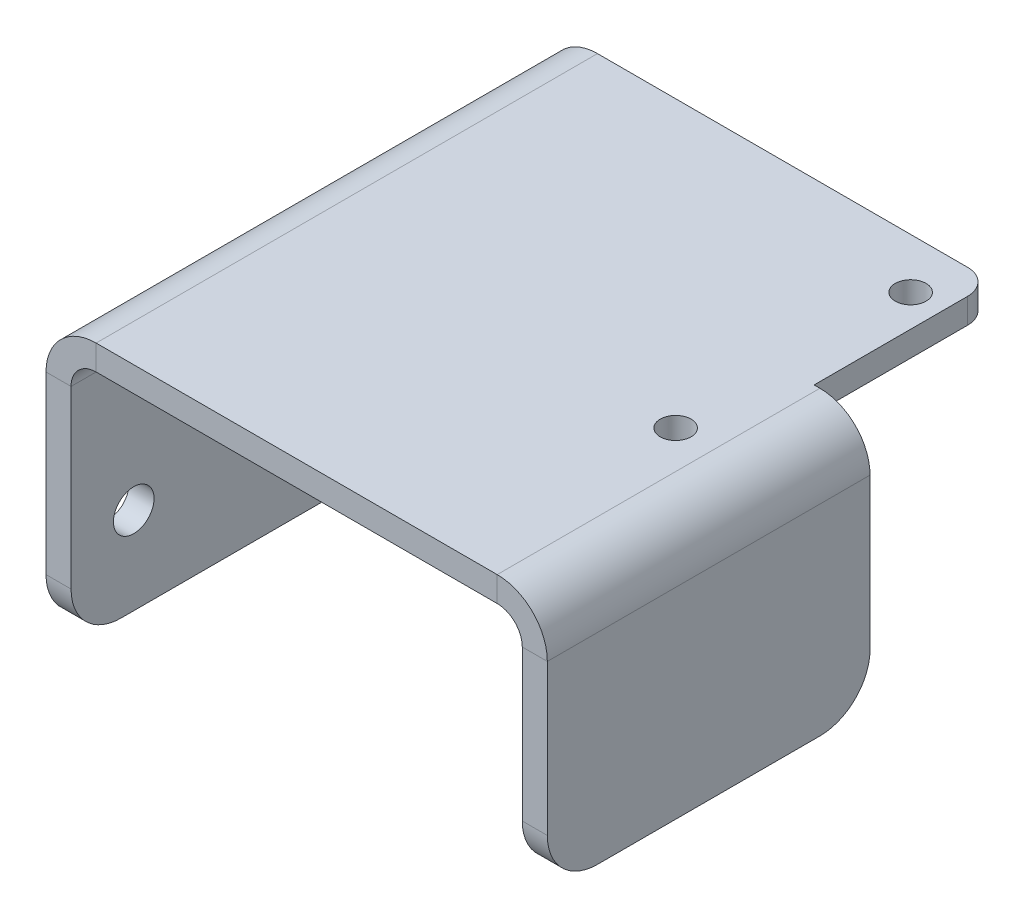
ISO-10303-21;
HEADER;
FILE_DESCRIPTION(('STEP AP214'),'2;1');
FILE_NAME('part.step','',(''),(''),'','','');
FILE_SCHEMA(('AUTOMOTIVE_DESIGN { 1 0 10303 214 1 1 1 1 }'));
ENDSEC;
DATA;
#1=APPLICATION_CONTEXT('core data for automotive mechanical design processes');
#2=APPLICATION_PROTOCOL_DEFINITION('international standard','automotive_design',2000,#1);
#3=PRODUCT_CONTEXT('',#1,'mechanical');
#4=PRODUCT('Part','Part','',(#3));
#5=PRODUCT_RELATED_PRODUCT_CATEGORY('part','',(#4));
#6=PRODUCT_DEFINITION_FORMATION('','',#4);
#7=PRODUCT_DEFINITION_CONTEXT('part definition',#1,'design');
#8=PRODUCT_DEFINITION('design','',#6,#7);
#9=PRODUCT_DEFINITION_SHAPE('','',#8);
#10=(LENGTH_UNIT() NAMED_UNIT(*) SI_UNIT(.MILLI.,.METRE.));
#11=(NAMED_UNIT(*) PLANE_ANGLE_UNIT() SI_UNIT($,.RADIAN.));
#12=(NAMED_UNIT(*) SI_UNIT($,.STERADIAN.) SOLID_ANGLE_UNIT());
#13=UNCERTAINTY_MEASURE_WITH_UNIT(LENGTH_MEASURE(1.E-05),#10,'distance_accuracy_value','');
#14=(GEOMETRIC_REPRESENTATION_CONTEXT(3) GLOBAL_UNCERTAINTY_ASSIGNED_CONTEXT((#13)) GLOBAL_UNIT_ASSIGNED_CONTEXT((#10,
#11,#12)) REPRESENTATION_CONTEXT('',''));
#15=CARTESIAN_POINT('',(0.,0.,0.));
#16=DIRECTION('',(0.,0.,1.));
#17=DIRECTION('',(1.,0.,0.));
#18=AXIS2_PLACEMENT_3D('',#15,#16,#17);
#19=CARTESIAN_POINT('',(52.85,2.00000000000003,-1.75));
#20=DIRECTION('',(0.,-1.,0.));
#21=DIRECTION('',(0.,0.,-1.));
#22=AXIS2_PLACEMENT_3D('',#19,#20,#21);
#23=PLANE('',#22);
#24=CARTESIAN_POINT('',(33.1,2.00000000000006,2.75));
#25=DIRECTION('',(0.,-1.,0.));
#26=DIRECTION('',(0.,0.,-1.));
#27=AXIS2_PLACEMENT_3D('',#24,#25,#26);
#28=CIRCLE('',#27,1.22949999999999);
#29=CARTESIAN_POINT('',(33.1,2.00000000000006,1.52050000000002));
#30=VERTEX_POINT('',#29);
#31=EDGE_CURVE('E282',#30,#30,#28,.T.);
#32=ORIENTED_EDGE('',*,*,#31,.T.);
#33=EDGE_LOOP('',(#32));
#34=FACE_BOUND('',#33,.T.);
#35=CARTESIAN_POINT('',(33.1,2.00000000000006,-16.));
#36=DIRECTION('',(0.,-1.,0.));
#37=DIRECTION('',(0.,0.,-1.));
#38=AXIS2_PLACEMENT_3D('',#35,#36,#37);
#39=CIRCLE('',#38,1.22949999999999);
#40=CARTESIAN_POINT('',(33.1,2.00000000000006,-17.2295));
#41=VERTEX_POINT('',#40);
#42=EDGE_CURVE('E285',#41,#41,#39,.T.);
#43=ORIENTED_EDGE('',*,*,#42,.T.);
#44=EDGE_LOOP('',(#43));
#45=FACE_BOUND('',#44,.T.);
#46=DIRECTION('',(1.,0.,0.));
#47=VECTOR('',#46,1.);
#48=CARTESIAN_POINT('',(-14.6,2.00000000000003,-20.));
#49=LINE('',#48,#47);
#50=CARTESIAN_POINT('',(4.11178799400001,2.00000000000003,-20.));
#51=VERTEX_POINT('',#50);
#52=CARTESIAN_POINT('',(33.65,2.00000000000003,-20.));
#53=VERTEX_POINT('',#52);
#54=EDGE_CURVE('E67',#51,#53,#49,.T.);
#55=ORIENTED_EDGE('',*,*,#54,.F.);
#56=DIRECTION('',(0.,0.,1.));
#57=VECTOR('',#56,1.);
#58=CARTESIAN_POINT('',(4.11178799400001,2.00000000000003,-1.74999999999999));
#59=LINE('',#58,#57);
#60=CARTESIAN_POINT('',(4.11178799400001,2.00000000000003,20.));
#61=VERTEX_POINT('',#60);
#62=EDGE_CURVE('E59',#51,#61,#59,.T.);
#63=ORIENTED_EDGE('',*,*,#62,.T.);
#64=DIRECTION('',(-1.,0.,0.));
#65=VECTOR('',#64,1.);
#66=CARTESIAN_POINT('',(52.85,2.00000000000003,20.));
#67=LINE('',#66,#65);
#68=CARTESIAN_POINT('',(36.111787994,2.00000000000003,20.));
#69=VERTEX_POINT('',#68);
#70=EDGE_CURVE('E78',#69,#61,#67,.T.);
#71=ORIENTED_EDGE('',*,*,#70,.F.);
#72=DIRECTION('',(0.,0.,-1.));
#73=VECTOR('',#72,1.);
#74=CARTESIAN_POINT('',(36.111787994,2.00000000000003,-1.75));
#75=LINE('',#74,#73);
#76=CARTESIAN_POINT('',(36.111787994,2.00000000000003,-5.75));
#77=VERTEX_POINT('',#76);
#78=EDGE_CURVE('E278',#69,#77,#75,.T.);
#79=ORIENTED_EDGE('',*,*,#78,.T.);
#80=DIRECTION('',(1.,0.,0.));
#81=VECTOR('',#80,1.);
#82=CARTESIAN_POINT('',(35.65,2.00000000000003,-5.75));
#83=LINE('',#82,#81);
#84=CARTESIAN_POINT('',(35.65,2.00000000000003,-5.75));
#85=VERTEX_POINT('',#84);
#86=EDGE_CURVE('E274',#85,#77,#83,.T.);
#87=ORIENTED_EDGE('',*,*,#86,.F.);
#88=DIRECTION('',(0.,0.,1.));
#89=VECTOR('',#88,1.);
#90=CARTESIAN_POINT('',(35.65,2.00000000000003,-18.));
#91=LINE('',#90,#89);
#92=CARTESIAN_POINT('',(35.65,2.00000000000003,-18.));
#93=VERTEX_POINT('',#92);
#94=EDGE_CURVE('E314',#93,#85,#91,.T.);
#95=ORIENTED_EDGE('',*,*,#94,.F.);
#96=CARTESIAN_POINT('',(33.65,2.00000000000003,-18.));
#97=DIRECTION('',(0.,-1.,0.));
#98=DIRECTION('',(0.,0.,-1.));
#99=AXIS2_PLACEMENT_3D('',#96,#97,#98);
#100=CIRCLE('',#99,2.);
#101=EDGE_CURVE('E307',#53,#93,#100,.T.);
#102=ORIENTED_EDGE('',*,*,#101,.F.);
#103=EDGE_LOOP('',(#55,#63,#71,#79,#87,#95,#102));
#104=FACE_BOUND('',#103,.T.);
#105=ADVANCED_FACE('F50',(#34,#45,#104),#23,.F.);
#106=CARTESIAN_POINT('',(40.111787994,-14.0258230256153,20.));
#107=DIRECTION('',(0.,0.,1.));
#108=DIRECTION('',(0.,-1.,0.));
#109=AXIS2_PLACEMENT_3D('',#106,#107,#108);
#110=PLANE('',#109);
#111=DIRECTION('',(0.,1.,0.));
#112=VECTOR('',#111,1.);
#113=CARTESIAN_POINT('',(40.111787994,-14.0258230256153,20.));
#114=LINE('',#113,#112);
#115=CARTESIAN_POINT('',(40.111787994,-14.0258230256153,20.));
#116=VERTEX_POINT('',#115);
#117=CARTESIAN_POINT('',(40.111787994,-1.99999999999999,20.));
#118=VERTEX_POINT('',#117);
#119=EDGE_CURVE('E348',#116,#118,#114,.T.);
#120=ORIENTED_EDGE('',*,*,#119,.T.);
#121=DIRECTION('',(-1.,0.,0.));
#122=VECTOR('',#121,1.);
#123=CARTESIAN_POINT('',(40.111787994,-1.99999999999999,20.));
#124=LINE('',#123,#122);
#125=CARTESIAN_POINT('',(38.111787994,-1.99999999999999,20.));
#126=VERTEX_POINT('',#125);
#127=EDGE_CURVE('E374',#118,#126,#124,.T.);
#128=ORIENTED_EDGE('',*,*,#127,.T.);
#129=DIRECTION('',(0.,1.,0.));
#130=VECTOR('',#129,1.);
#131=CARTESIAN_POINT('',(38.111787994,-14.0258230256153,20.));
#132=LINE('',#131,#130);
#133=CARTESIAN_POINT('',(38.111787994,-14.0258230256153,20.));
#134=VERTEX_POINT('',#133);
#135=EDGE_CURVE('E359',#134,#126,#132,.T.);
#136=ORIENTED_EDGE('',*,*,#135,.F.);
#137=DIRECTION('',(-1.,0.,0.));
#138=VECTOR('',#137,1.);
#139=CARTESIAN_POINT('',(40.111787994,-14.0258230256153,20.));
#140=LINE('',#139,#138);
#141=EDGE_CURVE('E360',#116,#134,#140,.T.);
#142=ORIENTED_EDGE('',*,*,#141,.F.);
#143=EDGE_LOOP('',(#120,#128,#136,#142));
#144=FACE_BOUND('',#143,.T.);
#145=ADVANCED_FACE('F459',(#144),#110,.T.);
#146=CARTESIAN_POINT('',(40.111787994,3.17417697438469,-5.75));
#147=DIRECTION('',(0.,0.,-1.));
#148=DIRECTION('',(0.,1.,0.));
#149=AXIS2_PLACEMENT_3D('',#146,#147,#148);
#150=PLANE('',#149);
#151=DIRECTION('',(0.,-1.,0.));
#152=VECTOR('',#151,1.);
#153=CARTESIAN_POINT('',(38.111787994,3.17417697438469,-5.75));
#154=LINE('',#153,#152);
#155=CARTESIAN_POINT('',(38.111787994,-1.99999999999999,-5.75));
#156=VERTEX_POINT('',#155);
#157=CARTESIAN_POINT('',(38.111787994,-14.0258230256153,-5.75));
#158=VERTEX_POINT('',#157);
#159=EDGE_CURVE('E277',#156,#158,#154,.T.);
#160=ORIENTED_EDGE('',*,*,#159,.F.);
#161=DIRECTION('',(1.,0.,0.));
#162=VECTOR('',#161,1.);
#163=CARTESIAN_POINT('',(40.111787994,-1.99999999999999,-5.75));
#164=LINE('',#163,#162);
#165=CARTESIAN_POINT('',(40.111787994,-1.99999999999999,-5.75));
#166=VERTEX_POINT('',#165);
#167=EDGE_CURVE('E381',#156,#166,#164,.T.);
#168=ORIENTED_EDGE('',*,*,#167,.T.);
#169=DIRECTION('',(0.,-1.,0.));
#170=VECTOR('',#169,1.);
#171=CARTESIAN_POINT('',(40.111787994,3.17417697438469,-5.75));
#172=LINE('',#171,#170);
#173=CARTESIAN_POINT('',(40.111787994,-14.0258230256153,-5.75));
#174=VERTEX_POINT('',#173);
#175=EDGE_CURVE('E340',#166,#174,#172,.T.);
#176=ORIENTED_EDGE('',*,*,#175,.T.);
#177=DIRECTION('',(-1.,0.,0.));
#178=VECTOR('',#177,1.);
#179=CARTESIAN_POINT('',(40.111787994,-14.0258230256153,-5.75));
#180=LINE('',#179,#178);
#181=EDGE_CURVE('E368',#174,#158,#180,.T.);
#182=ORIENTED_EDGE('',*,*,#181,.T.);
#183=EDGE_LOOP('',(#160,#168,#176,#182));
#184=FACE_BOUND('',#183,.T.);
#185=ADVANCED_FACE('F443',(#184),#150,.T.);
#186=CARTESIAN_POINT('',(38.111787994,-14.0258230256153,-1.75));
#187=DIRECTION('',(-1.,0.,0.));
#188=DIRECTION('',(0.,0.,-1.));
#189=AXIS2_PLACEMENT_3D('',#186,#187,#188);
#190=PLANE('',#189);
#191=ORIENTED_EDGE('',*,*,#135,.T.);
#192=DIRECTION('',(0.,0.,-1.));
#193=VECTOR('',#192,1.);
#194=CARTESIAN_POINT('',(38.111787994,-1.99999999999999,-1.75));
#195=LINE('',#194,#193);
#196=EDGE_CURVE('E363',#126,#156,#195,.T.);
#197=ORIENTED_EDGE('',*,*,#196,.T.);
#198=ORIENTED_EDGE('',*,*,#159,.T.);
#199=CARTESIAN_POINT('',(38.111787994,-14.0258230256153,-1.75));
#200=DIRECTION('',(-1.,0.,0.));
#201=DIRECTION('',(0.,0.,-1.));
#202=AXIS2_PLACEMENT_3D('',#199,#200,#201);
#203=CIRCLE('',#202,4.);
#204=CARTESIAN_POINT('',(38.111787994,-18.0258230256153,-1.75));
#205=VERTEX_POINT('',#204);
#206=EDGE_CURVE('E349',#158,#205,#203,.T.);
#207=ORIENTED_EDGE('',*,*,#206,.T.);
#208=DIRECTION('',(0.,0.,1.));
#209=VECTOR('',#208,1.);
#210=CARTESIAN_POINT('',(38.111787994,-18.0258230256153,-1.75));
#211=LINE('',#210,#209);
#212=CARTESIAN_POINT('',(38.111787994,-18.0258230256153,16.));
#213=VERTEX_POINT('',#212);
#214=EDGE_CURVE('E352',#205,#213,#211,.T.);
#215=ORIENTED_EDGE('',*,*,#214,.T.);
#216=CARTESIAN_POINT('',(38.111787994,-14.0258230256153,16.));
#217=DIRECTION('',(-1.,0.,0.));
#218=DIRECTION('',(0.,0.,-1.));
#219=AXIS2_PLACEMENT_3D('',#216,#217,#218);
#220=CIRCLE('',#219,4.00000000000001);
#221=EDGE_CURVE('E355',#213,#134,#220,.T.);
#222=ORIENTED_EDGE('',*,*,#221,.T.);
#223=EDGE_LOOP('',(#191,#197,#198,#207,#215,#222));
#224=FACE_BOUND('',#223,.T.);
#225=ADVANCED_FACE('F441',(#224),#190,.T.);
#226=CARTESIAN_POINT('',(40.111787994,-14.0258230256153,16.));
#227=DIRECTION('',(-1.,0.,0.));
#228=DIRECTION('',(0.,0.,-1.));
#229=AXIS2_PLACEMENT_3D('',#226,#227,#228);
#230=CYLINDRICAL_SURFACE('',#229,4.00000000000001);
#231=ORIENTED_EDGE('',*,*,#221,.F.);
#232=DIRECTION('',(-1.,0.,0.));
#233=VECTOR('',#232,1.);
#234=CARTESIAN_POINT('',(40.111787994,-18.0258230256153,16.));
#235=LINE('',#234,#233);
#236=CARTESIAN_POINT('',(40.111787994,-18.0258230256153,16.));
#237=VERTEX_POINT('',#236);
#238=EDGE_CURVE('E364',#237,#213,#235,.T.);
#239=ORIENTED_EDGE('',*,*,#238,.F.);
#240=CARTESIAN_POINT('',(40.111787994,-14.0258230256153,16.));
#241=DIRECTION('',(-1.,0.,0.));
#242=DIRECTION('',(0.,0.,-1.));
#243=AXIS2_PLACEMENT_3D('',#240,#241,#242);
#244=CIRCLE('',#243,4.00000000000001);
#245=EDGE_CURVE('E344',#237,#116,#244,.T.);
#246=ORIENTED_EDGE('',*,*,#245,.T.);
#247=ORIENTED_EDGE('',*,*,#141,.T.);
#248=EDGE_LOOP('',(#231,#239,#246,#247));
#249=FACE_BOUND('',#248,.T.);
#250=ADVANCED_FACE('F456',(#249),#230,.T.);
#251=CARTESIAN_POINT('',(40.111787994,-18.0258230256153,-1.75));
#252=DIRECTION('',(0.,-1.,0.));
#253=DIRECTION('',(0.,0.,-1.));
#254=AXIS2_PLACEMENT_3D('',#251,#252,#253);
#255=PLANE('',#254);
#256=ORIENTED_EDGE('',*,*,#214,.F.);
#257=DIRECTION('',(-1.,0.,0.));
#258=VECTOR('',#257,1.);
#259=CARTESIAN_POINT('',(40.111787994,-18.0258230256153,-1.75));
#260=LINE('',#259,#258);
#261=CARTESIAN_POINT('',(40.111787994,-18.0258230256153,-1.75));
#262=VERTEX_POINT('',#261);
#263=EDGE_CURVE('E366',#262,#205,#260,.T.);
#264=ORIENTED_EDGE('',*,*,#263,.F.);
#265=DIRECTION('',(0.,0.,1.));
#266=VECTOR('',#265,1.);
#267=CARTESIAN_POINT('',(40.111787994,-18.0258230256153,-1.75));
#268=LINE('',#267,#266);
#269=EDGE_CURVE('E339',#262,#237,#268,.T.);
#270=ORIENTED_EDGE('',*,*,#269,.T.);
#271=ORIENTED_EDGE('',*,*,#238,.T.);
#272=EDGE_LOOP('',(#256,#264,#270,#271));
#273=FACE_BOUND('',#272,.T.);
#274=ADVANCED_FACE('F452',(#273),#255,.T.);
#275=CARTESIAN_POINT('',(40.111787994,-14.0258230256153,-1.75));
#276=DIRECTION('',(-1.,0.,0.));
#277=DIRECTION('',(0.,0.,-1.));
#278=AXIS2_PLACEMENT_3D('',#275,#276,#277);
#279=CYLINDRICAL_SURFACE('',#278,4.);
#280=ORIENTED_EDGE('',*,*,#206,.F.);
#281=ORIENTED_EDGE('',*,*,#181,.F.);
#282=CARTESIAN_POINT('',(40.111787994,-14.0258230256153,-1.75));
#283=DIRECTION('',(-1.,0.,0.));
#284=DIRECTION('',(0.,0.,-1.));
#285=AXIS2_PLACEMENT_3D('',#282,#283,#284);
#286=CIRCLE('',#285,4.);
#287=EDGE_CURVE('E336',#174,#262,#286,.T.);
#288=ORIENTED_EDGE('',*,*,#287,.T.);
#289=ORIENTED_EDGE('',*,*,#263,.T.);
#290=EDGE_LOOP('',(#280,#281,#288,#289));
#291=FACE_BOUND('',#290,.T.);
#292=ADVANCED_FACE('F448',(#291),#279,.T.);
#293=CARTESIAN_POINT('',(40.111787994,-14.0258230256153,-1.75));
#294=DIRECTION('',(-1.,0.,0.));
#295=DIRECTION('',(0.,0.,-1.));
#296=AXIS2_PLACEMENT_3D('',#293,#294,#295);
#297=PLANE('',#296);
#298=DIRECTION('',(0.,0.,-1.));
#299=VECTOR('',#298,1.);
#300=CARTESIAN_POINT('',(40.111787994,-1.99999999999999,-1.75));
#301=LINE('',#300,#299);
#302=EDGE_CURVE('E378',#118,#166,#301,.T.);
#303=ORIENTED_EDGE('',*,*,#302,.F.);
#304=ORIENTED_EDGE('',*,*,#119,.F.);
#305=ORIENTED_EDGE('',*,*,#245,.F.);
#306=ORIENTED_EDGE('',*,*,#269,.F.);
#307=ORIENTED_EDGE('',*,*,#287,.F.);
#308=ORIENTED_EDGE('',*,*,#175,.F.);
#309=EDGE_LOOP('',(#303,#304,#305,#306,#307,#308));
#310=FACE_BOUND('',#309,.T.);
#311=ADVANCED_FACE('F565',(#310),#297,.F.);
#312=CARTESIAN_POINT('',(33.1,0.,2.75));
#313=DIRECTION('',(0.,-1.,0.));
#314=DIRECTION('',(0.,0.,-1.));
#315=AXIS2_PLACEMENT_3D('',#312,#313,#314);
#316=CYLINDRICAL_SURFACE('',#315,1.22949999999999);
#317=ORIENTED_EDGE('',*,*,#31,.F.);
#318=EDGE_LOOP('',(#317));
#319=FACE_BOUND('',#318,.T.);
#320=CARTESIAN_POINT('',(33.1,0.,2.75));
#321=DIRECTION('',(0.,-1.,0.));
#322=DIRECTION('',(0.,0.,-1.));
#323=AXIS2_PLACEMENT_3D('',#320,#321,#322);
#324=CIRCLE('',#323,1.22949999999999);
#325=CARTESIAN_POINT('',(33.1,0.,1.52050000000002));
#326=VERTEX_POINT('',#325);
#327=EDGE_CURVE('E322',#326,#326,#324,.T.);
#328=ORIENTED_EDGE('',*,*,#327,.T.);
#329=EDGE_LOOP('',(#328));
#330=FACE_BOUND('',#329,.T.);
#331=ADVANCED_FACE('F567',(#319,#330),#316,.F.);
#332=CARTESIAN_POINT('',(33.1,0.,-16.));
#333=DIRECTION('',(0.,-1.,0.));
#334=DIRECTION('',(0.,0.,-1.));
#335=AXIS2_PLACEMENT_3D('',#332,#333,#334);
#336=CYLINDRICAL_SURFACE('',#335,1.22949999999999);
#337=ORIENTED_EDGE('',*,*,#42,.F.);
#338=EDGE_LOOP('',(#337));
#339=FACE_BOUND('',#338,.T.);
#340=CARTESIAN_POINT('',(33.1,0.,-16.));
#341=DIRECTION('',(0.,-1.,0.));
#342=DIRECTION('',(0.,0.,-1.));
#343=AXIS2_PLACEMENT_3D('',#340,#341,#342);
#344=CIRCLE('',#343,1.22949999999999);
#345=CARTESIAN_POINT('',(33.1,0.,-17.2295));
#346=VERTEX_POINT('',#345);
#347=EDGE_CURVE('E318',#346,#346,#344,.T.);
#348=ORIENTED_EDGE('',*,*,#347,.T.);
#349=EDGE_LOOP('',(#348));
#350=FACE_BOUND('',#349,.T.);
#351=ADVANCED_FACE('F584',(#339,#350),#336,.F.);
#352=CARTESIAN_POINT('',(35.65,2.00000000000003,-18.));
#353=DIRECTION('',(1.,0.,0.));
#354=DIRECTION('',(0.,0.,-1.));
#355=AXIS2_PLACEMENT_3D('',#352,#353,#354);
#356=PLANE('',#355);
#357=DIRECTION('',(0.,0.,1.));
#358=VECTOR('',#357,1.);
#359=CARTESIAN_POINT('',(35.65,0.,-18.));
#360=LINE('',#359,#358);
#361=CARTESIAN_POINT('',(35.65,0.,-18.));
#362=VERTEX_POINT('',#361);
#363=CARTESIAN_POINT('',(35.65,0.,-5.75));
#364=VERTEX_POINT('',#363);
#365=EDGE_CURVE('E291',#362,#364,#360,.T.);
#366=ORIENTED_EDGE('',*,*,#365,.F.);
#367=DIRECTION('',(0.,-1.,0.));
#368=VECTOR('',#367,1.);
#369=CARTESIAN_POINT('',(35.65,2.00000000000003,-18.));
#370=LINE('',#369,#368);
#371=EDGE_CURVE('E304',#93,#362,#370,.T.);
#372=ORIENTED_EDGE('',*,*,#371,.F.);
#373=ORIENTED_EDGE('',*,*,#94,.T.);
#374=DIRECTION('',(0.,-1.,0.));
#375=VECTOR('',#374,1.);
#376=CARTESIAN_POINT('',(35.65,2.00000000000003,-5.75));
#377=LINE('',#376,#375);
#378=EDGE_CURVE('E311',#85,#364,#377,.T.);
#379=ORIENTED_EDGE('',*,*,#378,.T.);
#380=EDGE_LOOP('',(#366,#372,#373,#379));
#381=FACE_BOUND('',#380,.T.);
#382=ADVANCED_FACE('F423',(#381),#356,.T.);
#383=CARTESIAN_POINT('',(33.65,2.00000000000003,-18.));
#384=DIRECTION('',(0.,-1.,0.));
#385=DIRECTION('',(0.,0.,-1.));
#386=AXIS2_PLACEMENT_3D('',#383,#384,#385);
#387=CYLINDRICAL_SURFACE('',#386,2.);
#388=CARTESIAN_POINT('',(33.65,0.,-18.));
#389=DIRECTION('',(0.,-1.,0.));
#390=DIRECTION('',(0.,0.,-1.));
#391=AXIS2_PLACEMENT_3D('',#388,#389,#390);
#392=CIRCLE('',#391,2.);
#393=CARTESIAN_POINT('',(33.65,0.,-20.));
#394=VERTEX_POINT('',#393);
#395=EDGE_CURVE('E295',#394,#362,#392,.T.);
#396=ORIENTED_EDGE('',*,*,#395,.F.);
#397=DIRECTION('',(0.,-1.,0.));
#398=VECTOR('',#397,1.);
#399=CARTESIAN_POINT('',(33.65,2.00000000000003,-20.));
#400=LINE('',#399,#398);
#401=EDGE_CURVE('E299',#53,#394,#400,.T.);
#402=ORIENTED_EDGE('',*,*,#401,.F.);
#403=ORIENTED_EDGE('',*,*,#101,.T.);
#404=ORIENTED_EDGE('',*,*,#371,.T.);
#405=EDGE_LOOP('',(#396,#402,#403,#404));
#406=FACE_BOUND('',#405,.T.);
#407=ADVANCED_FACE('F419',(#406),#387,.T.);
#408=CARTESIAN_POINT('',(-14.6,2.00000000000003,-20.));
#409=DIRECTION('',(0.,0.,-1.));
#410=DIRECTION('',(-1.,0.,0.));
#411=AXIS2_PLACEMENT_3D('',#408,#409,#410);
#412=PLANE('',#411);
#413=DIRECTION('',(0.,-1.,0.));
#414=VECTOR('',#413,1.);
#415=CARTESIAN_POINT('',(4.11178799400001,2.00000000000003,-20.));
#416=LINE('',#415,#414);
#417=CARTESIAN_POINT('',(4.11178799400001,0.,-20.));
#418=VERTEX_POINT('',#417);
#419=EDGE_CURVE('E12',#51,#418,#416,.T.);
#420=ORIENTED_EDGE('',*,*,#419,.F.);
#421=ORIENTED_EDGE('',*,*,#54,.T.);
#422=ORIENTED_EDGE('',*,*,#401,.T.);
#423=DIRECTION('',(1.,0.,0.));
#424=VECTOR('',#423,1.);
#425=CARTESIAN_POINT('',(-14.6,0.,-20.));
#426=LINE('',#425,#424);
#427=EDGE_CURVE('E54',#418,#394,#426,.T.);
#428=ORIENTED_EDGE('',*,*,#427,.F.);
#429=EDGE_LOOP('',(#420,#421,#422,#428));
#430=FACE_BOUND('',#429,.T.);
#431=ADVANCED_FACE('F52',(#430),#412,.T.);
#432=CARTESIAN_POINT('',(52.85,0.,-1.75));
#433=DIRECTION('',(0.,-1.,0.));
#434=DIRECTION('',(0.,0.,-1.));
#435=AXIS2_PLACEMENT_3D('',#432,#433,#434);
#436=PLANE('',#435);
#437=DIRECTION('',(0.,0.,1.));
#438=VECTOR('',#437,1.);
#439=CARTESIAN_POINT('',(4.11178799400001,0.,-1.74999999999999));
#440=LINE('',#439,#438);
#441=CARTESIAN_POINT('',(4.11178799400002,0.,20.));
#442=VERTEX_POINT('',#441);
#443=EDGE_CURVE('E385',#418,#442,#440,.T.);
#444=ORIENTED_EDGE('',*,*,#443,.F.);
#445=ORIENTED_EDGE('',*,*,#427,.T.);
#446=ORIENTED_EDGE('',*,*,#395,.T.);
#447=ORIENTED_EDGE('',*,*,#365,.T.);
#448=DIRECTION('',(1.,0.,0.));
#449=VECTOR('',#448,1.);
#450=CARTESIAN_POINT('',(35.65,0.,-5.75));
#451=LINE('',#450,#449);
#452=CARTESIAN_POINT('',(36.111787994,0.,-5.75));
#453=VERTEX_POINT('',#452);
#454=EDGE_CURVE('E288',#364,#453,#451,.T.);
#455=ORIENTED_EDGE('',*,*,#454,.T.);
#456=DIRECTION('',(0.,0.,-1.));
#457=VECTOR('',#456,1.);
#458=CARTESIAN_POINT('',(36.111787994,0.,-1.75));
#459=LINE('',#458,#457);
#460=CARTESIAN_POINT('',(36.111787994,0.,20.));
#461=VERTEX_POINT('',#460);
#462=EDGE_CURVE('E267',#461,#453,#459,.T.);
#463=ORIENTED_EDGE('',*,*,#462,.F.);
#464=DIRECTION('',(-1.,0.,0.));
#465=VECTOR('',#464,1.);
#466=CARTESIAN_POINT('',(52.85,0.,20.));
#467=LINE('',#466,#465);
#468=EDGE_CURVE('E303',#461,#442,#467,.T.);
#469=ORIENTED_EDGE('',*,*,#468,.T.);
#470=EDGE_LOOP('',(#444,#445,#446,#447,#455,#463,#469));
#471=FACE_BOUND('',#470,.T.);
#472=ORIENTED_EDGE('',*,*,#347,.F.);
#473=EDGE_LOOP('',(#472));
#474=FACE_BOUND('',#473,.T.);
#475=ORIENTED_EDGE('',*,*,#327,.F.);
#476=EDGE_LOOP('',(#475));
#477=FACE_BOUND('',#476,.T.);
#478=ADVANCED_FACE('F413',(#471,#474,#477),#436,.T.);
#479=CARTESIAN_POINT('',(52.85,2.00000000000003,20.));
#480=DIRECTION('',(0.,0.,1.));
#481=DIRECTION('',(1.,0.,0.));
#482=AXIS2_PLACEMENT_3D('',#479,#480,#481);
#483=PLANE('',#482);
#484=DIRECTION('',(0.,1.,0.));
#485=VECTOR('',#484,1.);
#486=CARTESIAN_POINT('',(4.11178799400002,2.00000000000003,20.));
#487=LINE('',#486,#485);
#488=EDGE_CURVE('E399',#442,#61,#487,.T.);
#489=ORIENTED_EDGE('',*,*,#488,.F.);
#490=ORIENTED_EDGE('',*,*,#468,.F.);
#491=DIRECTION('',(0.,-1.,0.));
#492=VECTOR('',#491,1.);
#493=CARTESIAN_POINT('',(36.111787994,2.00000000000003,20.));
#494=LINE('',#493,#492);
#495=EDGE_CURVE('E325',#69,#461,#494,.T.);
#496=ORIENTED_EDGE('',*,*,#495,.F.);
#497=ORIENTED_EDGE('',*,*,#70,.T.);
#498=EDGE_LOOP('',(#489,#490,#496,#497));
#499=FACE_BOUND('',#498,.T.);
#500=ADVANCED_FACE('F468',(#499),#483,.T.);
#501=CARTESIAN_POINT('',(35.65,2.00000000000003,-5.75));
#502=DIRECTION('',(0.,0.,-1.));
#503=DIRECTION('',(-1.,0.,0.));
#504=AXIS2_PLACEMENT_3D('',#501,#502,#503);
#505=PLANE('',#504);
#506=DIRECTION('',(0.,1.,0.));
#507=VECTOR('',#506,1.);
#508=CARTESIAN_POINT('',(36.111787994,2.00000000000003,-5.75));
#509=LINE('',#508,#507);
#510=EDGE_CURVE('E329',#453,#77,#509,.T.);
#511=ORIENTED_EDGE('',*,*,#510,.F.);
#512=ORIENTED_EDGE('',*,*,#454,.F.);
#513=ORIENTED_EDGE('',*,*,#378,.F.);
#514=ORIENTED_EDGE('',*,*,#86,.T.);
#515=EDGE_LOOP('',(#511,#512,#513,#514));
#516=FACE_BOUND('',#515,.T.);
#517=ADVANCED_FACE('F427',(#516),#505,.T.);
#518=CARTESIAN_POINT('',(36.111787994,-1.99999999999999,20.));
#519=DIRECTION('',(0.,0.,-1.));
#520=DIRECTION('',(-1.,0.,0.));
#521=AXIS2_PLACEMENT_3D('',#518,#519,#520);
#522=PLANE('',#521);
#523=ORIENTED_EDGE('',*,*,#127,.F.);
#524=CARTESIAN_POINT('',(36.111787994,-1.99999999999999,20.));
#525=DIRECTION('',(0.,0.,1.));
#526=DIRECTION('',(1.,0.,0.));
#527=AXIS2_PLACEMENT_3D('',#524,#525,#526);
#528=CIRCLE('',#527,4.00000000000002);
#529=EDGE_CURVE('E252',#118,#69,#528,.T.);
#530=ORIENTED_EDGE('',*,*,#529,.T.);
#531=ORIENTED_EDGE('',*,*,#495,.T.);
#532=CARTESIAN_POINT('',(36.111787994,-1.99999999999999,20.));
#533=DIRECTION('',(0.,0.,1.));
#534=DIRECTION('',(1.,0.,0.));
#535=AXIS2_PLACEMENT_3D('',#532,#533,#534);
#536=CIRCLE('',#535,1.99999999999999);
#537=EDGE_CURVE('E259',#126,#461,#536,.T.);
#538=ORIENTED_EDGE('',*,*,#537,.F.);
#539=EDGE_LOOP('',(#523,#530,#531,#538));
#540=FACE_BOUND('',#539,.T.);
#541=ADVANCED_FACE('F463',(#540),#522,.F.);
#542=CARTESIAN_POINT('',(36.111787994,-1.99999999999999,-5.75));
#543=DIRECTION('',(0.,0.,1.));
#544=DIRECTION('',(1.,0.,0.));
#545=AXIS2_PLACEMENT_3D('',#542,#543,#544);
#546=PLANE('',#545);
#547=CARTESIAN_POINT('',(36.111787994,-1.99999999999999,-5.75));
#548=DIRECTION('',(0.,0.,1.));
#549=DIRECTION('',(1.,0.,0.));
#550=AXIS2_PLACEMENT_3D('',#547,#548,#549);
#551=CIRCLE('',#550,4.00000000000002);
#552=EDGE_CURVE('E264',#77,#166,#551,.F.);
#553=ORIENTED_EDGE('',*,*,#552,.T.);
#554=ORIENTED_EDGE('',*,*,#167,.F.);
#555=CARTESIAN_POINT('',(36.111787994,-1.99999999999999,-5.75));
#556=DIRECTION('',(0.,0.,-1.));
#557=DIRECTION('',(-1.,0.,0.));
#558=AXIS2_PLACEMENT_3D('',#555,#556,#557);
#559=CIRCLE('',#558,1.99999999999999);
#560=EDGE_CURVE('E263',#453,#156,#559,.T.);
#561=ORIENTED_EDGE('',*,*,#560,.F.);
#562=ORIENTED_EDGE('',*,*,#510,.T.);
#563=EDGE_LOOP('',(#553,#554,#561,#562));
#564=FACE_BOUND('',#563,.T.);
#565=ADVANCED_FACE('F436',(#564),#546,.F.);
#566=CARTESIAN_POINT('',(36.111787994,-1.99999999999999,-19.128935131756));
#567=DIRECTION('',(0.,0.,1.));
#568=DIRECTION('',(1.,0.,0.));
#569=AXIS2_PLACEMENT_3D('',#566,#567,#568);
#570=CYLINDRICAL_SURFACE('',#569,1.99999999999999);
#571=ORIENTED_EDGE('',*,*,#462,.T.);
#572=ORIENTED_EDGE('',*,*,#560,.T.);
#573=ORIENTED_EDGE('',*,*,#196,.F.);
#574=ORIENTED_EDGE('',*,*,#537,.T.);
#575=EDGE_LOOP('',(#571,#572,#573,#574));
#576=FACE_BOUND('',#575,.T.);
#577=ADVANCED_FACE('F433',(#576),#570,.F.);
#578=CARTESIAN_POINT('',(36.111787994,-1.99999999999999,-19.128935131756));
#579=DIRECTION('',(0.,0.,1.));
#580=DIRECTION('',(1.,0.,0.));
#581=AXIS2_PLACEMENT_3D('',#578,#579,#580);
#582=CYLINDRICAL_SURFACE('',#581,4.00000000000002);
#583=ORIENTED_EDGE('',*,*,#78,.F.);
#584=ORIENTED_EDGE('',*,*,#529,.F.);
#585=ORIENTED_EDGE('',*,*,#302,.T.);
#586=ORIENTED_EDGE('',*,*,#552,.F.);
#587=EDGE_LOOP('',(#583,#584,#585,#586));
#588=FACE_BOUND('',#587,.T.);
#589=ADVANCED_FACE('F466',(#588),#582,.T.);
#590=CARTESIAN_POINT('',(4.11178799400001,-1.99999999999997,-20.));
#591=DIRECTION('',(0.,0.,1.));
#592=DIRECTION('',(1.,0.,0.));
#593=AXIS2_PLACEMENT_3D('',#590,#591,#592);
#594=PLANE('',#593);
#595=DIRECTION('',(1.,0.,0.));
#596=VECTOR('',#595,1.);
#597=CARTESIAN_POINT('',(0.111787994000009,-1.99999999999997,-20.));
#598=LINE('',#597,#596);
#599=CARTESIAN_POINT('',(0.111787994000009,-1.99999999999998,-20.));
#600=VERTEX_POINT('',#599);
#601=CARTESIAN_POINT('',(2.11178799400003,-1.99999999999997,-20.));
#602=VERTEX_POINT('',#601);
#603=EDGE_CURVE('E231',#600,#602,#598,.T.);
#604=ORIENTED_EDGE('',*,*,#603,.F.);
#605=CARTESIAN_POINT('',(4.11178799400001,-1.99999999999997,-20.));
#606=DIRECTION('',(0.,0.,-1.));
#607=DIRECTION('',(-1.,0.,0.));
#608=AXIS2_PLACEMENT_3D('',#605,#606,#607);
#609=CIRCLE('',#608,4.);
#610=EDGE_CURVE('E253',#600,#51,#609,.T.);
#611=ORIENTED_EDGE('',*,*,#610,.T.);
#612=ORIENTED_EDGE('',*,*,#419,.T.);
#613=CARTESIAN_POINT('',(4.11178799400001,-1.99999999999997,-20.));
#614=DIRECTION('',(0.,0.,-1.));
#615=DIRECTION('',(-1.,0.,0.));
#616=AXIS2_PLACEMENT_3D('',#613,#614,#615);
#617=CIRCLE('',#616,1.99999999999997);
#618=EDGE_CURVE('E244',#602,#418,#617,.T.);
#619=ORIENTED_EDGE('',*,*,#618,.F.);
#620=EDGE_LOOP('',(#604,#611,#612,#619));
#621=FACE_BOUND('',#620,.T.);
#622=ADVANCED_FACE('F539',(#621),#594,.F.);
#623=CARTESIAN_POINT('',(4.11178799400002,-1.99999999999997,20.));
#624=DIRECTION('',(0.,0.,-1.));
#625=DIRECTION('',(-1.,0.,0.));
#626=AXIS2_PLACEMENT_3D('',#623,#624,#625);
#627=PLANE('',#626);
#628=CARTESIAN_POINT('',(4.11178799400002,-1.99999999999997,20.));
#629=DIRECTION('',(0.,0.,-1.));
#630=DIRECTION('',(-1.,0.,0.));
#631=AXIS2_PLACEMENT_3D('',#628,#629,#630);
#632=CIRCLE('',#631,4.);
#633=CARTESIAN_POINT('',(0.111787994000018,-1.99999999999998,20.));
#634=VERTEX_POINT('',#633);
#635=EDGE_CURVE('E248',#61,#634,#632,.F.);
#636=ORIENTED_EDGE('',*,*,#635,.T.);
#637=DIRECTION('',(-1.,0.,0.));
#638=VECTOR('',#637,1.);
#639=CARTESIAN_POINT('',(0.111787994000018,-1.99999999999998,20.));
#640=LINE('',#639,#638);
#641=CARTESIAN_POINT('',(2.11178799400005,-1.99999999999998,20.));
#642=VERTEX_POINT('',#641);
#643=EDGE_CURVE('E479',#642,#634,#640,.T.);
#644=ORIENTED_EDGE('',*,*,#643,.F.);
#645=CARTESIAN_POINT('',(4.11178799400002,-1.99999999999997,20.));
#646=DIRECTION('',(0.,0.,1.));
#647=DIRECTION('',(1.,0.,0.));
#648=AXIS2_PLACEMENT_3D('',#645,#646,#647);
#649=CIRCLE('',#648,1.99999999999997);
#650=EDGE_CURVE('E247',#442,#642,#649,.T.);
#651=ORIENTED_EDGE('',*,*,#650,.F.);
#652=ORIENTED_EDGE('',*,*,#488,.T.);
#653=EDGE_LOOP('',(#636,#644,#651,#652));
#654=FACE_BOUND('',#653,.T.);
#655=ADVANCED_FACE('F477',(#654),#627,.F.);
#656=CARTESIAN_POINT('',(4.11178799400002,-1.99999999999997,40.3262521182226));
#657=DIRECTION('',(0.,0.,-1.));
#658=DIRECTION('',(-1.,0.,0.));
#659=AXIS2_PLACEMENT_3D('',#656,#657,#658);
#660=CYLINDRICAL_SURFACE('',#659,1.99999999999997);
#661=ORIENTED_EDGE('',*,*,#443,.T.);
#662=ORIENTED_EDGE('',*,*,#650,.T.);
#663=DIRECTION('',(0.,0.,1.));
#664=VECTOR('',#663,1.);
#665=CARTESIAN_POINT('',(2.11178799400004,-1.99999999999998,-1.74999999999999));
#666=LINE('',#665,#664);
#667=EDGE_CURVE('E501',#602,#642,#666,.T.);
#668=ORIENTED_EDGE('',*,*,#667,.F.);
#669=ORIENTED_EDGE('',*,*,#618,.T.);
#670=EDGE_LOOP('',(#661,#662,#668,#669));
#671=FACE_BOUND('',#670,.T.);
#672=ADVANCED_FACE('F473',(#671),#660,.F.);
#673=CARTESIAN_POINT('',(4.11178799400002,-1.99999999999997,40.3262521182226));
#674=DIRECTION('',(0.,0.,-1.));
#675=DIRECTION('',(-1.,0.,0.));
#676=AXIS2_PLACEMENT_3D('',#673,#674,#675);
#677=CYLINDRICAL_SURFACE('',#676,4.);
#678=ORIENTED_EDGE('',*,*,#62,.F.);
#679=ORIENTED_EDGE('',*,*,#610,.F.);
#680=DIRECTION('',(0.,0.,1.));
#681=VECTOR('',#680,1.);
#682=CARTESIAN_POINT('',(0.111787994000013,-1.99999999999998,-1.74999999999999));
#683=LINE('',#682,#681);
#684=EDGE_CURVE('E228',#600,#634,#683,.T.);
#685=ORIENTED_EDGE('',*,*,#684,.T.);
#686=ORIENTED_EDGE('',*,*,#635,.F.);
#687=EDGE_LOOP('',(#678,#679,#685,#686));
#688=FACE_BOUND('',#687,.T.);
#689=ADVANCED_FACE('F541',(#688),#677,.T.);
#690=CARTESIAN_POINT('',(0.111787994000009,-15.9993990136153,-16.));
#691=DIRECTION('',(1.,0.,0.));
#692=DIRECTION('',(0.,0.,-1.));
#693=AXIS2_PLACEMENT_3D('',#690,#691,#692);
#694=CYLINDRICAL_SURFACE('',#693,4.);
#695=CARTESIAN_POINT('',(2.11178799400004,-15.9993990136153,-16.));
#696=DIRECTION('',(1.,0.,0.));
#697=DIRECTION('',(0.,0.,-1.));
#698=AXIS2_PLACEMENT_3D('',#695,#696,#697);
#699=CIRCLE('',#698,4.);
#700=CARTESIAN_POINT('',(2.11178799400004,-19.9993990136153,-16.));
#701=VERTEX_POINT('',#700);
#702=CARTESIAN_POINT('',(2.11178799400004,-15.9993990136153,-20.));
#703=VERTEX_POINT('',#702);
#704=EDGE_CURVE('E483',#701,#703,#699,.T.);
#705=ORIENTED_EDGE('',*,*,#704,.F.);
#706=DIRECTION('',(1.,0.,0.));
#707=VECTOR('',#706,1.);
#708=CARTESIAN_POINT('',(0.111787994000009,-19.9993990136153,-16.));
#709=LINE('',#708,#707);
#710=CARTESIAN_POINT('',(0.111787994000009,-19.9993990136153,-16.));
#711=VERTEX_POINT('',#710);
#712=EDGE_CURVE('E235',#711,#701,#709,.T.);
#713=ORIENTED_EDGE('',*,*,#712,.F.);
#714=CARTESIAN_POINT('',(0.111787994000009,-15.9993990136153,-16.));
#715=DIRECTION('',(1.,0.,0.));
#716=DIRECTION('',(0.,0.,-1.));
#717=AXIS2_PLACEMENT_3D('',#714,#715,#716);
#718=CIRCLE('',#717,4.);
#719=CARTESIAN_POINT('',(0.111787994000009,-15.9993990136153,-20.));
#720=VERTEX_POINT('',#719);
#721=EDGE_CURVE('E219',#711,#720,#718,.T.);
#722=ORIENTED_EDGE('',*,*,#721,.T.);
#723=DIRECTION('',(1.,0.,0.));
#724=VECTOR('',#723,1.);
#725=CARTESIAN_POINT('',(0.111787994000009,-15.9993990136153,-20.));
#726=LINE('',#725,#724);
#727=EDGE_CURVE('E206',#720,#703,#726,.T.);
#728=ORIENTED_EDGE('',*,*,#727,.T.);
#729=EDGE_LOOP('',(#705,#713,#722,#728));
#730=FACE_BOUND('',#729,.T.);
#731=ADVANCED_FACE('F234',(#730),#694,.T.);
#732=CARTESIAN_POINT('',(0.111787994000016,-19.9993990136153,16.));
#733=DIRECTION('',(0.,-1.,0.));
#734=DIRECTION('',(0.,0.,1.));
#735=AXIS2_PLACEMENT_3D('',#732,#733,#734);
#736=PLANE('',#735);
#737=DIRECTION('',(0.,0.,-1.));
#738=VECTOR('',#737,1.);
#739=CARTESIAN_POINT('',(2.11178799400005,-19.9993990136153,16.));
#740=LINE('',#739,#738);
#741=CARTESIAN_POINT('',(2.11178799400005,-19.9993990136153,16.));
#742=VERTEX_POINT('',#741);
#743=EDGE_CURVE('E488',#742,#701,#740,.T.);
#744=ORIENTED_EDGE('',*,*,#743,.F.);
#745=DIRECTION('',(1.,0.,0.));
#746=VECTOR('',#745,1.);
#747=CARTESIAN_POINT('',(0.111787994000016,-19.9993990136153,16.));
#748=LINE('',#747,#746);
#749=CARTESIAN_POINT('',(0.111787994000016,-19.9993990136153,16.));
#750=VERTEX_POINT('',#749);
#751=EDGE_CURVE('E519',#750,#742,#748,.T.);
#752=ORIENTED_EDGE('',*,*,#751,.F.);
#753=DIRECTION('',(0.,0.,-1.));
#754=VECTOR('',#753,1.);
#755=CARTESIAN_POINT('',(0.111787994000016,-19.9993990136153,16.));
#756=LINE('',#755,#754);
#757=EDGE_CURVE('E218',#750,#711,#756,.T.);
#758=ORIENTED_EDGE('',*,*,#757,.T.);
#759=ORIENTED_EDGE('',*,*,#712,.T.);
#760=EDGE_LOOP('',(#744,#752,#758,#759));
#761=FACE_BOUND('',#760,.T.);
#762=ADVANCED_FACE('F527',(#761),#736,.T.);
#763=CARTESIAN_POINT('',(0.111787994000016,-15.9993990136153,16.));
#764=DIRECTION('',(1.,0.,0.));
#765=DIRECTION('',(0.,0.,-1.));
#766=AXIS2_PLACEMENT_3D('',#763,#764,#765);
#767=CYLINDRICAL_SURFACE('',#766,4.);
#768=CARTESIAN_POINT('',(2.11178799400005,-15.9993990136153,16.));
#769=DIRECTION('',(1.,0.,0.));
#770=DIRECTION('',(0.,0.,-1.));
#771=AXIS2_PLACEMENT_3D('',#768,#769,#770);
#772=CIRCLE('',#771,4.);
#773=CARTESIAN_POINT('',(2.11178799400005,-15.9993990136153,20.));
#774=VERTEX_POINT('',#773);
#775=EDGE_CURVE('E495',#774,#742,#772,.T.);
#776=ORIENTED_EDGE('',*,*,#775,.F.);
#777=DIRECTION('',(1.,0.,0.));
#778=VECTOR('',#777,1.);
#779=CARTESIAN_POINT('',(0.111787994000017,-15.9993990136153,20.));
#780=LINE('',#779,#778);
#781=CARTESIAN_POINT('',(0.111787994000017,-15.9993990136153,20.));
#782=VERTEX_POINT('',#781);
#783=EDGE_CURVE('E232',#782,#774,#780,.T.);
#784=ORIENTED_EDGE('',*,*,#783,.F.);
#785=CARTESIAN_POINT('',(0.111787994000016,-15.9993990136153,16.));
#786=DIRECTION('',(1.,0.,0.));
#787=DIRECTION('',(0.,0.,-1.));
#788=AXIS2_PLACEMENT_3D('',#785,#786,#787);
#789=CIRCLE('',#788,4.);
#790=EDGE_CURVE('E521',#782,#750,#789,.T.);
#791=ORIENTED_EDGE('',*,*,#790,.T.);
#792=ORIENTED_EDGE('',*,*,#751,.T.);
#793=EDGE_LOOP('',(#776,#784,#791,#792));
#794=FACE_BOUND('',#793,.T.);
#795=ADVANCED_FACE('F532',(#794),#767,.T.);
#796=CARTESIAN_POINT('',(0.111787994000016,-13.0493990136153,15.));
#797=DIRECTION('',(-1.,0.,0.));
#798=DIRECTION('',(0.,0.,1.));
#799=AXIS2_PLACEMENT_3D('',#796,#797,#798);
#800=CYLINDRICAL_SURFACE('',#799,1.62099999999999);
#801=CARTESIAN_POINT('',(2.11178799400005,-13.0493990136153,15.));
#802=DIRECTION('',(-1.,0.,0.));
#803=DIRECTION('',(0.,0.,1.));
#804=AXIS2_PLACEMENT_3D('',#801,#802,#803);
#805=CIRCLE('',#804,1.62099999999999);
#806=CARTESIAN_POINT('',(2.11178799400005,-13.0493990136153,16.621));
#807=VERTEX_POINT('',#806);
#808=EDGE_CURVE('E506',#807,#807,#805,.T.);
#809=ORIENTED_EDGE('',*,*,#808,.F.);
#810=EDGE_LOOP('',(#809));
#811=FACE_BOUND('',#810,.T.);
#812=CARTESIAN_POINT('',(0.111787994000015,-13.0493990136153,15.));
#813=DIRECTION('',(-1.,0.,0.));
#814=DIRECTION('',(0.,0.,1.));
#815=AXIS2_PLACEMENT_3D('',#812,#813,#814);
#816=CIRCLE('',#815,1.62099999999999);
#817=CARTESIAN_POINT('',(0.111787994000015,-13.0493990136153,16.621));
#818=VERTEX_POINT('',#817);
#819=EDGE_CURVE('E516',#818,#818,#816,.T.);
#820=ORIENTED_EDGE('',*,*,#819,.T.);
#821=EDGE_LOOP('',(#820));
#822=FACE_BOUND('',#821,.T.);
#823=ADVANCED_FACE('F645',(#811,#822),#800,.F.);
#824=CARTESIAN_POINT('',(0.11178799400001,-13.0493990136153,-15.));
#825=DIRECTION('',(-1.,0.,0.));
#826=DIRECTION('',(0.,0.,1.));
#827=AXIS2_PLACEMENT_3D('',#824,#825,#826);
#828=CYLINDRICAL_SURFACE('',#827,1.62099999999999);
#829=CARTESIAN_POINT('',(2.11178799400004,-13.0493990136153,-15.));
#830=DIRECTION('',(-1.,0.,0.));
#831=DIRECTION('',(0.,0.,1.));
#832=AXIS2_PLACEMENT_3D('',#829,#830,#831);
#833=CIRCLE('',#832,1.62099999999999);
#834=CARTESIAN_POINT('',(2.11178799400004,-13.0493990136153,-13.379));
#835=VERTEX_POINT('',#834);
#836=EDGE_CURVE('E509',#835,#835,#833,.T.);
#837=ORIENTED_EDGE('',*,*,#836,.F.);
#838=EDGE_LOOP('',(#837));
#839=FACE_BOUND('',#838,.T.);
#840=CARTESIAN_POINT('',(0.111787994000009,-13.0493990136153,-15.));
#841=DIRECTION('',(-1.,0.,0.));
#842=DIRECTION('',(0.,0.,1.));
#843=AXIS2_PLACEMENT_3D('',#840,#841,#842);
#844=CIRCLE('',#843,1.62099999999999);
#845=CARTESIAN_POINT('',(0.111787994000009,-13.0493990136153,-13.379));
#846=VERTEX_POINT('',#845);
#847=EDGE_CURVE('E513',#846,#846,#844,.T.);
#848=ORIENTED_EDGE('',*,*,#847,.T.);
#849=EDGE_LOOP('',(#848));
#850=FACE_BOUND('',#849,.T.);
#851=ADVANCED_FACE('F654',(#839,#850),#828,.F.);
#852=CARTESIAN_POINT('',(2.11178799400005,51.4506009863847,-1.74999999999999));
#853=DIRECTION('',(1.,0.,0.));
#854=DIRECTION('',(0.,0.,-1.));
#855=AXIS2_PLACEMENT_3D('',#852,#853,#854);
#856=PLANE('',#855);
#857=ORIENTED_EDGE('',*,*,#836,.T.);
#858=EDGE_LOOP('',(#857));
#859=FACE_BOUND('',#858,.T.);
#860=ORIENTED_EDGE('',*,*,#808,.T.);
#861=EDGE_LOOP('',(#860));
#862=FACE_BOUND('',#861,.T.);
#863=DIRECTION('',(0.,1.,0.));
#864=VECTOR('',#863,1.);
#865=CARTESIAN_POINT('',(2.11178799400004,-15.9993990136153,-20.));
#866=LINE('',#865,#864);
#867=EDGE_CURVE('E212',#703,#602,#866,.T.);
#868=ORIENTED_EDGE('',*,*,#867,.T.);
#869=ORIENTED_EDGE('',*,*,#667,.T.);
#870=DIRECTION('',(0.,-1.,0.));
#871=VECTOR('',#870,1.);
#872=CARTESIAN_POINT('',(2.11178799400005,51.4506009863847,20.));
#873=LINE('',#872,#871);
#874=EDGE_CURVE('E498',#642,#774,#873,.T.);
#875=ORIENTED_EDGE('',*,*,#874,.T.);
#876=ORIENTED_EDGE('',*,*,#775,.T.);
#877=ORIENTED_EDGE('',*,*,#743,.T.);
#878=ORIENTED_EDGE('',*,*,#704,.T.);
#879=EDGE_LOOP('',(#868,#869,#875,#876,#877,#878));
#880=FACE_BOUND('',#879,.T.);
#881=ADVANCED_FACE('F538',(#859,#862,#880),#856,.T.);
#882=CARTESIAN_POINT('',(0.111787994000021,51.4506009863847,20.));
#883=DIRECTION('',(0.,0.,1.));
#884=DIRECTION('',(0.,1.,0.));
#885=AXIS2_PLACEMENT_3D('',#882,#883,#884);
#886=PLANE('',#885);
#887=ORIENTED_EDGE('',*,*,#874,.F.);
#888=ORIENTED_EDGE('',*,*,#643,.T.);
#889=DIRECTION('',(0.,-1.,0.));
#890=VECTOR('',#889,1.);
#891=CARTESIAN_POINT('',(0.111787994000021,51.4506009863847,20.));
#892=LINE('',#891,#890);
#893=EDGE_CURVE('E482',#634,#782,#892,.T.);
#894=ORIENTED_EDGE('',*,*,#893,.T.);
#895=ORIENTED_EDGE('',*,*,#783,.T.);
#896=EDGE_LOOP('',(#887,#888,#894,#895));
#897=FACE_BOUND('',#896,.T.);
#898=ADVANCED_FACE('F674',(#897),#886,.T.);
#899=CARTESIAN_POINT('',(0.111787994000016,51.4506009863847,-1.74999999999999));
#900=DIRECTION('',(1.,0.,0.));
#901=DIRECTION('',(0.,0.,-1.));
#902=AXIS2_PLACEMENT_3D('',#899,#900,#901);
#903=PLANE('',#902);
#904=ORIENTED_EDGE('',*,*,#684,.F.);
#905=DIRECTION('',(0.,1.,0.));
#906=VECTOR('',#905,1.);
#907=CARTESIAN_POINT('',(0.111787994000009,-15.9993990136153,-20.));
#908=LINE('',#907,#906);
#909=EDGE_CURVE('E209',#720,#600,#908,.T.);
#910=ORIENTED_EDGE('',*,*,#909,.F.);
#911=ORIENTED_EDGE('',*,*,#721,.F.);
#912=ORIENTED_EDGE('',*,*,#757,.F.);
#913=ORIENTED_EDGE('',*,*,#790,.F.);
#914=ORIENTED_EDGE('',*,*,#893,.F.);
#915=EDGE_LOOP('',(#904,#910,#911,#912,#913,#914));
#916=FACE_BOUND('',#915,.T.);
#917=ORIENTED_EDGE('',*,*,#819,.F.);
#918=EDGE_LOOP('',(#917));
#919=FACE_BOUND('',#918,.T.);
#920=ORIENTED_EDGE('',*,*,#847,.F.);
#921=EDGE_LOOP('',(#920));
#922=FACE_BOUND('',#921,.T.);
#923=ADVANCED_FACE('F223',(#916,#919,#922),#903,.F.);
#924=CARTESIAN_POINT('',(0.111787994000009,-15.9993990136153,-20.));
#925=DIRECTION('',(0.,0.,-1.));
#926=DIRECTION('',(0.,-1.,0.));
#927=AXIS2_PLACEMENT_3D('',#924,#925,#926);
#928=PLANE('',#927);
#929=ORIENTED_EDGE('',*,*,#909,.T.);
#930=ORIENTED_EDGE('',*,*,#603,.T.);
#931=ORIENTED_EDGE('',*,*,#867,.F.);
#932=ORIENTED_EDGE('',*,*,#727,.F.);
#933=EDGE_LOOP('',(#929,#930,#931,#932));
#934=FACE_BOUND('',#933,.T.);
#935=ADVANCED_FACE('F208',(#934),#928,.T.);
#936=CLOSED_SHELL('',(#105,#145,#185,#225,#250,#274,#292,#311,#331,#351,#382,#407,#431,#478,
#500,#517,#541,#565,#577,#589,#622,#655,#672,#689,#731,#762,#795,#823,#851,#881,#898,#923,#935));
#937=MANIFOLD_SOLID_BREP('B2',#936);
#938=ADVANCED_BREP_SHAPE_REPRESENTATION('',(#18,#937),#14);
#939=SHAPE_DEFINITION_REPRESENTATION(#9,#938);
ENDSEC;
END-ISO-10303-21;
